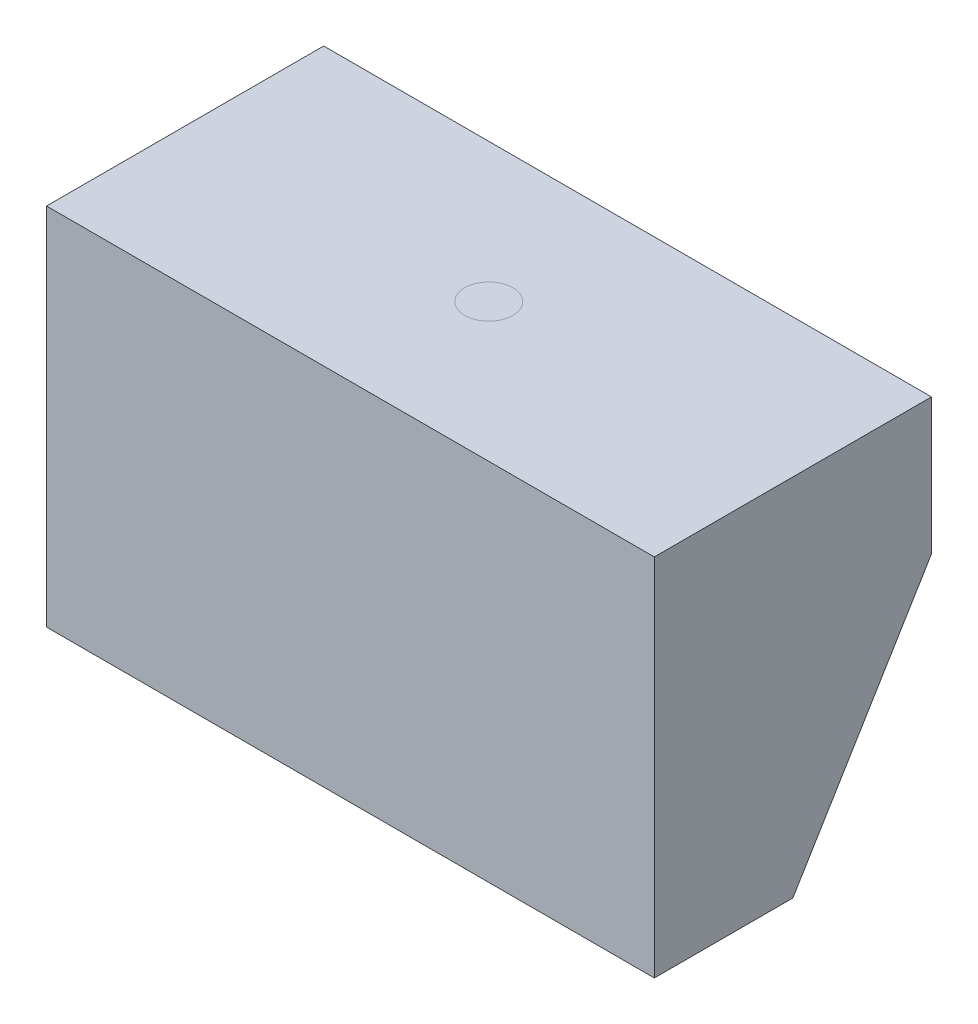
ISO-10303-21;
HEADER;
FILE_DESCRIPTION(('STEP AP214'),'2;1');
FILE_NAME('part.step','',(''),(''),'','','');
FILE_SCHEMA(('AUTOMOTIVE_DESIGN { 1 0 10303 214 1 1 1 1 }'));
ENDSEC;
DATA;
#1=APPLICATION_CONTEXT('core data for automotive mechanical design processes');
#2=APPLICATION_PROTOCOL_DEFINITION('international standard','automotive_design',2000,#1);
#3=PRODUCT_CONTEXT('',#1,'mechanical');
#4=PRODUCT('Part','Part','',(#3));
#5=PRODUCT_RELATED_PRODUCT_CATEGORY('part','',(#4));
#6=PRODUCT_DEFINITION_FORMATION('','',#4);
#7=PRODUCT_DEFINITION_CONTEXT('part definition',#1,'design');
#8=PRODUCT_DEFINITION('design','',#6,#7);
#9=PRODUCT_DEFINITION_SHAPE('','',#8);
#10=(LENGTH_UNIT() NAMED_UNIT(*) SI_UNIT(.MILLI.,.METRE.));
#11=(NAMED_UNIT(*) PLANE_ANGLE_UNIT() SI_UNIT($,.RADIAN.));
#12=(NAMED_UNIT(*) SI_UNIT($,.STERADIAN.) SOLID_ANGLE_UNIT());
#13=UNCERTAINTY_MEASURE_WITH_UNIT(LENGTH_MEASURE(1.E-05),#10,'distance_accuracy_value','');
#14=(GEOMETRIC_REPRESENTATION_CONTEXT(3) GLOBAL_UNCERTAINTY_ASSIGNED_CONTEXT((#13)) GLOBAL_UNIT_ASSIGNED_CONTEXT((#10,
#11,#12)) REPRESENTATION_CONTEXT('',''));
#15=CARTESIAN_POINT('',(0.,0.,0.));
#16=DIRECTION('',(0.,0.,1.));
#17=DIRECTION('',(1.,0.,0.));
#18=AXIS2_PLACEMENT_3D('',#15,#16,#17);
#19=CARTESIAN_POINT('',(-125.,75.,57.));
#20=DIRECTION('',(0.,-1.,0.));
#21=DIRECTION('',(0.,0.,-1.));
#22=AXIS2_PLACEMENT_3D('',#19,#20,#21);
#23=PLANE('',#22);
#24=CARTESIAN_POINT('',(0.,75.,0.0925226692224876));
#25=DIRECTION('',(0.,1.,0.));
#26=DIRECTION('',(0.,0.,1.));
#27=AXIS2_PLACEMENT_3D('',#24,#25,#26);
#28=CIRCLE('',#27,9.89484920947829);
#29=CARTESIAN_POINT('',(0.,75.,9.98737187870078));
#30=VERTEX_POINT('',#29);
#31=EDGE_CURVE('P0_E18',#30,#30,#28,.T.);
#32=ORIENTED_EDGE('',*,*,#31,.T.);
#33=EDGE_LOOP('',(#32));
#34=FACE_BOUND('',#33,.T.);
#35=ADVANCED_FACE('P0_F15',(#34),#23,.F.);
#36=CARTESIAN_POINT('',(0.,65.,0.0925226692224876));
#37=DIRECTION('',(0.,1.,0.));
#38=DIRECTION('',(0.,0.,1.));
#39=AXIS2_PLACEMENT_3D('',#36,#37,#38);
#40=CYLINDRICAL_SURFACE('',#39,9.89484920947829);
#41=CARTESIAN_POINT('',(0.,65.,0.0925226692224876));
#42=DIRECTION('',(0.,1.,0.));
#43=DIRECTION('',(0.,0.,1.));
#44=AXIS2_PLACEMENT_3D('',#41,#42,#43);
#45=CIRCLE('',#44,9.89484920947829);
#46=CARTESIAN_POINT('',(0.,65.,9.98737187870078));
#47=VERTEX_POINT('',#46);
#48=EDGE_CURVE('P0_E10',#47,#47,#45,.T.);
#49=ORIENTED_EDGE('',*,*,#48,.T.);
#50=EDGE_LOOP('',(#49));
#51=FACE_BOUND('',#50,.T.);
#52=ORIENTED_EDGE('',*,*,#31,.F.);
#53=EDGE_LOOP('',(#52));
#54=FACE_BOUND('',#53,.T.);
#55=ADVANCED_FACE('P0_F28',(#51,#54),#40,.T.);
#56=CARTESIAN_POINT('',(0.,65.,0.0925226692224876));
#57=DIRECTION('',(0.,1.,0.));
#58=DIRECTION('',(0.,0.,1.));
#59=AXIS2_PLACEMENT_3D('',#56,#57,#58);
#60=PLANE('',#59);
#61=ORIENTED_EDGE('',*,*,#48,.F.);
#62=EDGE_LOOP('',(#61));
#63=FACE_BOUND('',#62,.T.);
#64=ADVANCED_FACE('P0_F30',(#63),#60,.F.);
#65=CLOSED_SHELL('',(#35,#55,#64));
#66=MANIFOLD_SOLID_BREP('P0_B1',#65);
#67=CARTESIAN_POINT('',(0.,0.,-57.));
#68=DIRECTION('',(0.,0.,-1.));
#69=DIRECTION('',(-1.,0.,0.));
#70=AXIS2_PLACEMENT_3D('',#67,#68,#69);
#71=PLANE('',#70);
#72=CARTESIAN_POINT('',(-25.5219113985845,0.,-57.));
#73=DIRECTION('',(0.,0.,-1.));
#74=DIRECTION('',(-1.,0.,0.));
#75=AXIS2_PLACEMENT_3D('',#72,#73,#74);
#76=CIRCLE('',#75,21.2566947196087);
#77=CARTESIAN_POINT('',(-46.7786061181932,0.,-57.));
#78=VERTEX_POINT('',#77);
#79=EDGE_CURVE('P1_E160',#78,#78,#76,.T.);
#80=ORIENTED_EDGE('',*,*,#79,.F.);
#81=EDGE_LOOP('',(#80));
#82=FACE_BOUND('',#81,.T.);
#83=DIRECTION('',(0.,1.,0.));
#84=VECTOR('',#83,1.);
#85=CARTESIAN_POINT('',(125.,-75.,-57.));
#86=LINE('',#85,#84);
#87=CARTESIAN_POINT('',(125.,19.0618301711685,-57.));
#88=VERTEX_POINT('',#87);
#89=CARTESIAN_POINT('',(125.,75.,-57.));
#90=VERTEX_POINT('',#89);
#91=EDGE_CURVE('P1_E99',#88,#90,#86,.T.);
#92=ORIENTED_EDGE('',*,*,#91,.F.);
#93=DIRECTION('',(-0.66032679808164,-0.750978375011724,0.));
#94=VECTOR('',#93,1.);
#95=CARTESIAN_POINT('',(61.0434721622796,-53.6748351989157,-57.));
#96=LINE('',#95,#94);
#97=CARTESIAN_POINT('',(42.292495755744,-75.,-57.));
#98=VERTEX_POINT('',#97);
#99=EDGE_CURVE('P1_E10',#88,#98,#96,.T.);
#100=ORIENTED_EDGE('',*,*,#99,.T.);
#101=DIRECTION('',(1.,0.,0.));
#102=VECTOR('',#101,1.);
#103=CARTESIAN_POINT('',(-125.,-75.,-57.));
#104=LINE('',#103,#102);
#105=CARTESIAN_POINT('',(-125.,-75.,-57.));
#106=VERTEX_POINT('',#105);
#107=EDGE_CURVE('P1_E116',#106,#98,#104,.T.);
#108=ORIENTED_EDGE('',*,*,#107,.F.);
#109=DIRECTION('',(0.,-1.,0.));
#110=VECTOR('',#109,1.);
#111=CARTESIAN_POINT('',(-125.,-75.,-57.));
#112=LINE('',#111,#110);
#113=CARTESIAN_POINT('',(-125.,75.,-57.));
#114=VERTEX_POINT('',#113);
#115=EDGE_CURVE('P1_E71',#114,#106,#112,.T.);
#116=ORIENTED_EDGE('',*,*,#115,.F.);
#117=DIRECTION('',(-1.,0.,0.));
#118=VECTOR('',#117,1.);
#119=CARTESIAN_POINT('',(-125.,75.,-57.));
#120=LINE('',#119,#118);
#121=EDGE_CURVE('P1_E105',#90,#114,#120,.T.);
#122=ORIENTED_EDGE('',*,*,#121,.F.);
#123=EDGE_LOOP('',(#92,#100,#108,#116,#122));
#124=FACE_BOUND('',#123,.T.);
#125=ADVANCED_FACE('P1_F16',(#82,#124),#71,.T.);
#126=CARTESIAN_POINT('',(27.9069349234818,-24.5382524923008,-97.4932094496149));
#127=DIRECTION('',(0.507766315458884,-0.446473182740372,-0.736773415629929));
#128=DIRECTION('',(-0.823397266330031,0.,-0.567465366168044));
#129=AXIS2_PLACEMENT_3D('',#126,#127,#128);
#130=PLANE('',#129);
#131=DIRECTION('',(0.,-0.855226725322334,0.518254038377355));
#132=VECTOR('',#131,1.);
#133=CARTESIAN_POINT('',(125.,-100.263808135213,15.3094731527829));
#134=LINE('',#133,#132);
#135=CARTESIAN_POINT('',(125.,-75.,0.));
#136=VERTEX_POINT('',#135);
#137=EDGE_CURVE('P1_E91',#88,#136,#134,.T.);
#138=ORIENTED_EDGE('',*,*,#137,.T.);
#139=DIRECTION('',(-0.823397266330031,0.,-0.567465366168044));
#140=VECTOR('',#139,1.);
#141=CARTESIAN_POINT('',(-17.862546969277,-75.,-98.4573921273212));
#142=LINE('',#141,#140);
#143=EDGE_CURVE('P1_E37',#136,#98,#142,.T.);
#144=ORIENTED_EDGE('',*,*,#143,.T.);
#145=ORIENTED_EDGE('',*,*,#99,.F.);
#146=EDGE_LOOP('',(#138,#144,#145));
#147=FACE_BOUND('',#146,.T.);
#148=ADVANCED_FACE('P1_F90',(#147),#130,.T.);
#149=CARTESIAN_POINT('',(-125.,-75.,57.));
#150=DIRECTION('',(0.,1.,0.));
#151=DIRECTION('',(0.,0.,1.));
#152=AXIS2_PLACEMENT_3D('',#149,#150,#151);
#153=PLANE('',#152);
#154=ORIENTED_EDGE('',*,*,#143,.F.);
#155=DIRECTION('',(0.,0.,-1.));
#156=VECTOR('',#155,1.);
#157=CARTESIAN_POINT('',(125.,-75.,57.));
#158=LINE('',#157,#156);
#159=CARTESIAN_POINT('',(125.,-75.,57.));
#160=VERTEX_POINT('',#159);
#161=EDGE_CURVE('P1_E102',#160,#136,#158,.T.);
#162=ORIENTED_EDGE('',*,*,#161,.F.);
#163=DIRECTION('',(1.,0.,0.));
#164=VECTOR('',#163,1.);
#165=CARTESIAN_POINT('',(-125.,-75.,57.));
#166=LINE('',#165,#164);
#167=CARTESIAN_POINT('',(-125.,-75.,57.));
#168=VERTEX_POINT('',#167);
#169=EDGE_CURVE('P1_E47',#168,#160,#166,.T.);
#170=ORIENTED_EDGE('',*,*,#169,.F.);
#171=DIRECTION('',(0.,0.,-1.));
#172=VECTOR('',#171,1.);
#173=CARTESIAN_POINT('',(-125.,-75.,57.));
#174=LINE('',#173,#172);
#175=EDGE_CURVE('P1_E122',#168,#106,#174,.T.);
#176=ORIENTED_EDGE('',*,*,#175,.T.);
#177=ORIENTED_EDGE('',*,*,#107,.T.);
#178=EDGE_LOOP('',(#154,#162,#170,#176,#177));
#179=FACE_BOUND('',#178,.T.);
#180=ADVANCED_FACE('P1_F150',(#179),#153,.F.);
#181=CARTESIAN_POINT('',(125.,-75.,57.));
#182=DIRECTION('',(-1.,0.,0.));
#183=DIRECTION('',(0.,0.,1.));
#184=AXIS2_PLACEMENT_3D('',#181,#182,#183);
#185=PLANE('',#184);
#186=ORIENTED_EDGE('',*,*,#137,.F.);
#187=ORIENTED_EDGE('',*,*,#91,.T.);
#188=DIRECTION('',(0.,0.,-1.));
#189=VECTOR('',#188,1.);
#190=CARTESIAN_POINT('',(125.,75.,57.));
#191=LINE('',#190,#189);
#192=CARTESIAN_POINT('',(125.,75.,57.));
#193=VERTEX_POINT('',#192);
#194=EDGE_CURVE('P1_E25',#193,#90,#191,.T.);
#195=ORIENTED_EDGE('',*,*,#194,.F.);
#196=DIRECTION('',(0.,1.,0.));
#197=VECTOR('',#196,1.);
#198=CARTESIAN_POINT('',(125.,-75.,57.));
#199=LINE('',#198,#197);
#200=EDGE_CURVE('P1_E119',#160,#193,#199,.T.);
#201=ORIENTED_EDGE('',*,*,#200,.F.);
#202=ORIENTED_EDGE('',*,*,#161,.T.);
#203=EDGE_LOOP('',(#186,#187,#195,#201,#202));
#204=FACE_BOUND('',#203,.T.);
#205=ADVANCED_FACE('P1_F18',(#204),#185,.F.);
#206=CARTESIAN_POINT('',(-125.,-75.,57.));
#207=DIRECTION('',(1.,0.,0.));
#208=DIRECTION('',(0.,0.,-1.));
#209=AXIS2_PLACEMENT_3D('',#206,#207,#208);
#210=PLANE('',#209);
#211=ORIENTED_EDGE('',*,*,#115,.T.);
#212=ORIENTED_EDGE('',*,*,#175,.F.);
#213=DIRECTION('',(0.,-1.,0.));
#214=VECTOR('',#213,1.);
#215=CARTESIAN_POINT('',(-125.,-75.,57.));
#216=LINE('',#215,#214);
#217=CARTESIAN_POINT('',(-125.,75.,57.));
#218=VERTEX_POINT('',#217);
#219=EDGE_CURVE('P1_E134',#218,#168,#216,.T.);
#220=ORIENTED_EDGE('',*,*,#219,.F.);
#221=DIRECTION('',(0.,0.,-1.));
#222=VECTOR('',#221,1.);
#223=CARTESIAN_POINT('',(-125.,75.,57.));
#224=LINE('',#223,#222);
#225=EDGE_CURVE('P1_E125',#218,#114,#224,.T.);
#226=ORIENTED_EDGE('',*,*,#225,.T.);
#227=EDGE_LOOP('',(#211,#212,#220,#226));
#228=FACE_BOUND('',#227,.T.);
#229=ADVANCED_FACE('P1_F148',(#228),#210,.F.);
#230=CARTESIAN_POINT('',(0.,0.,57.));
#231=DIRECTION('',(0.,0.,-1.));
#232=DIRECTION('',(-1.,0.,0.));
#233=AXIS2_PLACEMENT_3D('',#230,#231,#232);
#234=PLANE('',#233);
#235=ORIENTED_EDGE('',*,*,#200,.T.);
#236=DIRECTION('',(-1.,0.,0.));
#237=VECTOR('',#236,1.);
#238=CARTESIAN_POINT('',(-125.,75.,57.));
#239=LINE('',#238,#237);
#240=EDGE_CURVE('P1_E81',#193,#218,#239,.T.);
#241=ORIENTED_EDGE('',*,*,#240,.T.);
#242=ORIENTED_EDGE('',*,*,#219,.T.);
#243=ORIENTED_EDGE('',*,*,#169,.T.);
#244=EDGE_LOOP('',(#235,#241,#242,#243));
#245=FACE_BOUND('',#244,.T.);
#246=ADVANCED_FACE('P1_F147',(#245),#234,.F.);
#247=CARTESIAN_POINT('',(-125.,75.,57.));
#248=DIRECTION('',(0.,-1.,0.));
#249=DIRECTION('',(0.,0.,-1.));
#250=AXIS2_PLACEMENT_3D('',#247,#248,#249);
#251=PLANE('',#250);
#252=CARTESIAN_POINT('',(0.,75.,0.0925226692224876));
#253=DIRECTION('',(0.,1.,0.));
#254=DIRECTION('',(0.,0.,1.));
#255=AXIS2_PLACEMENT_3D('',#252,#253,#254);
#256=CIRCLE('',#255,9.89484920947829);
#257=CARTESIAN_POINT('',(0.,75.,9.98737187870078));
#258=VERTEX_POINT('',#257);
#259=EDGE_CURVE('P1_E154',#258,#258,#256,.T.);
#260=ORIENTED_EDGE('',*,*,#259,.F.);
#261=EDGE_LOOP('',(#260));
#262=FACE_BOUND('',#261,.T.);
#263=ORIENTED_EDGE('',*,*,#121,.T.);
#264=ORIENTED_EDGE('',*,*,#225,.F.);
#265=ORIENTED_EDGE('',*,*,#240,.F.);
#266=ORIENTED_EDGE('',*,*,#194,.T.);
#267=EDGE_LOOP('',(#263,#264,#265,#266));
#268=FACE_BOUND('',#267,.T.);
#269=ADVANCED_FACE('P1_F129',(#262,#268),#251,.F.);
#270=CARTESIAN_POINT('',(0.,65.,0.0925226692224876));
#271=DIRECTION('',(0.,1.,0.));
#272=DIRECTION('',(0.,0.,1.));
#273=AXIS2_PLACEMENT_3D('',#270,#271,#272);
#274=CYLINDRICAL_SURFACE('',#273,9.89484920947829);
#275=CARTESIAN_POINT('',(0.,65.,0.0925226692224876));
#276=DIRECTION('',(0.,1.,0.));
#277=DIRECTION('',(0.,0.,1.));
#278=AXIS2_PLACEMENT_3D('',#275,#276,#277);
#279=CIRCLE('',#278,9.89484920947829);
#280=CARTESIAN_POINT('',(0.,65.,9.98737187870078));
#281=VERTEX_POINT('',#280);
#282=EDGE_CURVE('P1_E151',#281,#281,#279,.T.);
#283=ORIENTED_EDGE('',*,*,#282,.F.);
#284=EDGE_LOOP('',(#283));
#285=FACE_BOUND('',#284,.T.);
#286=ORIENTED_EDGE('',*,*,#259,.T.);
#287=EDGE_LOOP('',(#286));
#288=FACE_BOUND('',#287,.T.);
#289=ADVANCED_FACE('P1_F188',(#285,#288),#274,.F.);
#290=CARTESIAN_POINT('',(0.,65.,0.0925226692224876));
#291=DIRECTION('',(0.,1.,0.));
#292=DIRECTION('',(0.,0.,1.));
#293=AXIS2_PLACEMENT_3D('',#290,#291,#292);
#294=PLANE('',#293);
#295=ORIENTED_EDGE('',*,*,#282,.T.);
#296=EDGE_LOOP('',(#295));
#297=FACE_BOUND('',#296,.T.);
#298=ADVANCED_FACE('P1_F174',(#297),#294,.T.);
#299=CARTESIAN_POINT('',(-25.5219113985845,0.,-3.));
#300=DIRECTION('',(0.,0.,-1.));
#301=DIRECTION('',(-1.,0.,0.));
#302=AXIS2_PLACEMENT_3D('',#299,#300,#301);
#303=CYLINDRICAL_SURFACE('',#302,21.2566947196087);
#304=CARTESIAN_POINT('',(-25.5219113985845,0.,-3.));
#305=DIRECTION('',(0.,0.,-1.));
#306=DIRECTION('',(-1.,0.,0.));
#307=AXIS2_PLACEMENT_3D('',#304,#305,#306);
#308=CIRCLE('',#307,21.2566947196087);
#309=CARTESIAN_POINT('',(-46.7786061181932,0.,-3.));
#310=VERTEX_POINT('',#309);
#311=EDGE_CURVE('P1_E158',#310,#310,#308,.T.);
#312=ORIENTED_EDGE('',*,*,#311,.F.);
#313=EDGE_LOOP('',(#312));
#314=FACE_BOUND('',#313,.T.);
#315=ORIENTED_EDGE('',*,*,#79,.T.);
#316=EDGE_LOOP('',(#315));
#317=FACE_BOUND('',#316,.T.);
#318=ADVANCED_FACE('P1_F171',(#314,#317),#303,.F.);
#319=CARTESIAN_POINT('',(-25.5219113985845,0.,-3.));
#320=DIRECTION('',(0.,0.,-1.));
#321=DIRECTION('',(-1.,0.,0.));
#322=AXIS2_PLACEMENT_3D('',#319,#320,#321);
#323=PLANE('',#322);
#324=ORIENTED_EDGE('',*,*,#311,.T.);
#325=EDGE_LOOP('',(#324));
#326=FACE_BOUND('',#325,.T.);
#327=ADVANCED_FACE('P1_F169',(#326),#323,.T.);
#328=CLOSED_SHELL('',(#125,#148,#180,#205,#229,#246,#269,#289,#298,#318,#327));
#329=MANIFOLD_SOLID_BREP('P1_B1',#328);
#330=CARTESIAN_POINT('',(0.,0.,-57.));
#331=DIRECTION('',(0.,0.,-1.));
#332=DIRECTION('',(-1.,0.,0.));
#333=AXIS2_PLACEMENT_3D('',#330,#331,#332);
#334=PLANE('',#333);
#335=CARTESIAN_POINT('',(-25.5219113985845,0.,-57.));
#336=DIRECTION('',(0.,0.,-1.));
#337=DIRECTION('',(-1.,0.,0.));
#338=AXIS2_PLACEMENT_3D('',#335,#336,#337);
#339=CIRCLE('',#338,21.2566947196087);
#340=CARTESIAN_POINT('',(-46.7786061181932,0.,-57.));
#341=VERTEX_POINT('',#340);
#342=EDGE_CURVE('P2_E18',#341,#341,#339,.T.);
#343=ORIENTED_EDGE('',*,*,#342,.T.);
#344=EDGE_LOOP('',(#343));
#345=FACE_BOUND('',#344,.T.);
#346=ADVANCED_FACE('P2_F15',(#345),#334,.T.);
#347=CARTESIAN_POINT('',(-25.5219113985845,0.,-3.));
#348=DIRECTION('',(0.,0.,-1.));
#349=DIRECTION('',(-1.,0.,0.));
#350=AXIS2_PLACEMENT_3D('',#347,#348,#349);
#351=CYLINDRICAL_SURFACE('',#350,21.2566947196087);
#352=CARTESIAN_POINT('',(-25.5219113985845,0.,-3.));
#353=DIRECTION('',(0.,0.,-1.));
#354=DIRECTION('',(-1.,0.,0.));
#355=AXIS2_PLACEMENT_3D('',#352,#353,#354);
#356=CIRCLE('',#355,21.2566947196087);
#357=CARTESIAN_POINT('',(-46.7786061181932,0.,-3.));
#358=VERTEX_POINT('',#357);
#359=EDGE_CURVE('P2_E10',#358,#358,#356,.T.);
#360=ORIENTED_EDGE('',*,*,#359,.T.);
#361=EDGE_LOOP('',(#360));
#362=FACE_BOUND('',#361,.T.);
#363=ORIENTED_EDGE('',*,*,#342,.F.);
#364=EDGE_LOOP('',(#363));
#365=FACE_BOUND('',#364,.T.);
#366=ADVANCED_FACE('P2_F35',(#362,#365),#351,.T.);
#367=CARTESIAN_POINT('',(-25.5219113985845,0.,-3.));
#368=DIRECTION('',(0.,0.,-1.));
#369=DIRECTION('',(-1.,0.,0.));
#370=AXIS2_PLACEMENT_3D('',#367,#368,#369);
#371=PLANE('',#370);
#372=ORIENTED_EDGE('',*,*,#359,.F.);
#373=EDGE_LOOP('',(#372));
#374=FACE_BOUND('',#373,.T.);
#375=ADVANCED_FACE('P2_F37',(#374),#371,.F.);
#376=CLOSED_SHELL('',(#346,#366,#375));
#377=MANIFOLD_SOLID_BREP('P2_B1',#376);
#378=ADVANCED_BREP_SHAPE_REPRESENTATION('',(#18,#66,#329,#377),#14);
#379=SHAPE_DEFINITION_REPRESENTATION(#9,#378);
ENDSEC;
END-ISO-10303-21;
